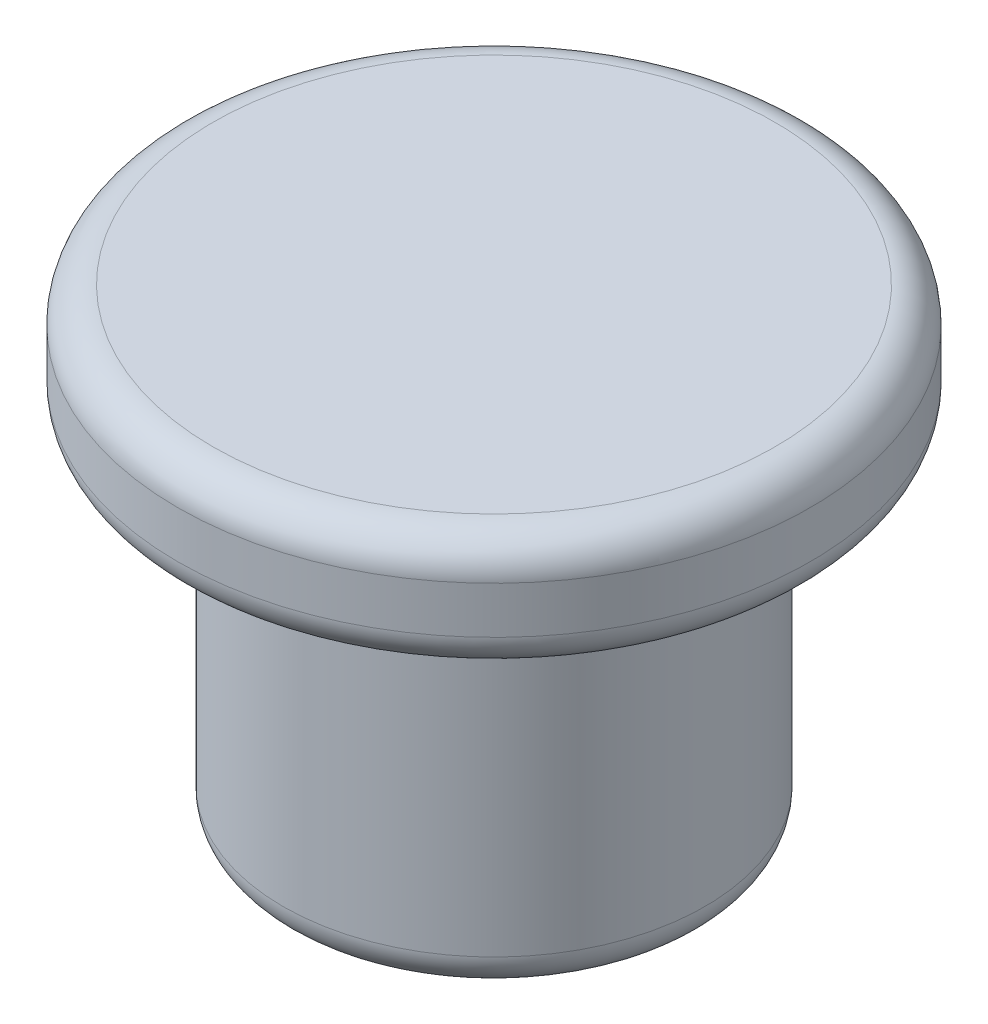
ISO-10303-21;
HEADER;
FILE_DESCRIPTION(('STEP AP214'),'2;1');
FILE_NAME('part.step','',(''),(''),'','','');
FILE_SCHEMA(('AUTOMOTIVE_DESIGN { 1 0 10303 214 1 1 1 1 }'));
ENDSEC;
DATA;
#1=APPLICATION_CONTEXT('core data for automotive mechanical design processes');
#2=APPLICATION_PROTOCOL_DEFINITION('international standard','automotive_design',2000,#1);
#3=PRODUCT_CONTEXT('',#1,'mechanical');
#4=PRODUCT('Part','Part','',(#3));
#5=PRODUCT_RELATED_PRODUCT_CATEGORY('part','',(#4));
#6=PRODUCT_DEFINITION_FORMATION('','',#4);
#7=PRODUCT_DEFINITION_CONTEXT('part definition',#1,'design');
#8=PRODUCT_DEFINITION('design','',#6,#7);
#9=PRODUCT_DEFINITION_SHAPE('','',#8);
#10=(LENGTH_UNIT() NAMED_UNIT(*) SI_UNIT(.MILLI.,.METRE.));
#11=(NAMED_UNIT(*) PLANE_ANGLE_UNIT() SI_UNIT($,.RADIAN.));
#12=(NAMED_UNIT(*) SI_UNIT($,.STERADIAN.) SOLID_ANGLE_UNIT());
#13=UNCERTAINTY_MEASURE_WITH_UNIT(LENGTH_MEASURE(1.E-05),#10,'distance_accuracy_value','');
#14=(GEOMETRIC_REPRESENTATION_CONTEXT(3) GLOBAL_UNCERTAINTY_ASSIGNED_CONTEXT((#13)) GLOBAL_UNIT_ASSIGNED_CONTEXT((#10,
#11,#12)) REPRESENTATION_CONTEXT('',''));
#15=CARTESIAN_POINT('',(0.,0.,0.));
#16=DIRECTION('',(0.,0.,1.));
#17=DIRECTION('',(1.,0.,0.));
#18=AXIS2_PLACEMENT_3D('',#15,#16,#17);
#19=CARTESIAN_POINT('',(-14.,0.,0.));
#20=DIRECTION('',(0.,-1.,0.));
#21=DIRECTION('',(0.,0.,-1.));
#22=AXIS2_PLACEMENT_3D('',#19,#20,#21);
#23=PLANE('',#22);
#24=CARTESIAN_POINT('',(0.,0.,0.));
#25=DIRECTION('',(0.,-1.,0.));
#26=DIRECTION('',(0.,0.,-1.));
#27=AXIS2_PLACEMENT_3D('',#24,#25,#26);
#28=CIRCLE('',#27,15.);
#29=CARTESIAN_POINT('',(0.,0.,-15.));
#30=VERTEX_POINT('',#29);
#31=EDGE_CURVE('E52',#30,#30,#28,.T.);
#32=ORIENTED_EDGE('',*,*,#31,.T.);
#33=EDGE_LOOP('',(#32));
#34=FACE_BOUND('',#33,.T.);
#35=CARTESIAN_POINT('',(0.,0.,0.));
#36=DIRECTION('',(0.,1.,0.));
#37=DIRECTION('',(0.,0.,1.));
#38=AXIS2_PLACEMENT_3D('',#35,#36,#37);
#39=CIRCLE('',#38,14.);
#40=CARTESIAN_POINT('',(0.,0.,14.));
#41=VERTEX_POINT('',#40);
#42=EDGE_CURVE('E79',#41,#41,#39,.T.);
#43=ORIENTED_EDGE('',*,*,#42,.T.);
#44=EDGE_LOOP('',(#43));
#45=FACE_BOUND('',#44,.T.);
#46=ADVANCED_FACE('F41',(#34,#45),#23,.T.);
#47=CARTESIAN_POINT('',(0.,0.,0.));
#48=DIRECTION('',(0.,1.,0.));
#49=DIRECTION('',(0.,0.,1.));
#50=AXIS2_PLACEMENT_3D('',#47,#48,#49);
#51=CYLINDRICAL_SURFACE('',#50,18.);
#52=CARTESIAN_POINT('',(0.,3.,0.));
#53=DIRECTION('',(0.,-1.,0.));
#54=DIRECTION('',(0.,0.,-1.));
#55=AXIS2_PLACEMENT_3D('',#52,#53,#54);
#56=CIRCLE('',#55,18.);
#57=CARTESIAN_POINT('',(0.,3.,-18.));
#58=VERTEX_POINT('',#57);
#59=EDGE_CURVE('E56',#58,#58,#56,.F.);
#60=ORIENTED_EDGE('',*,*,#59,.T.);
#61=EDGE_LOOP('',(#60));
#62=FACE_BOUND('',#61,.T.);
#63=CARTESIAN_POINT('',(0.,27.,0.));
#64=DIRECTION('',(0.,-1.,0.));
#65=DIRECTION('',(0.,0.,-1.));
#66=AXIS2_PLACEMENT_3D('',#63,#64,#65);
#67=CIRCLE('',#66,18.);
#68=CARTESIAN_POINT('',(0.,27.,-18.));
#69=VERTEX_POINT('',#68);
#70=EDGE_CURVE('E61',#69,#69,#67,.T.);
#71=ORIENTED_EDGE('',*,*,#70,.T.);
#72=EDGE_LOOP('',(#71));
#73=FACE_BOUND('',#72,.T.);
#74=ADVANCED_FACE('F101',(#62,#73),#51,.T.);
#75=CARTESIAN_POINT('',(-18.,30.,0.));
#76=DIRECTION('',(0.,-1.,0.));
#77=DIRECTION('',(0.,0.,-1.));
#78=AXIS2_PLACEMENT_3D('',#75,#76,#77);
#79=PLANE('',#78);
#80=CARTESIAN_POINT('',(0.,30.,0.));
#81=DIRECTION('',(0.,-1.,0.));
#82=DIRECTION('',(0.,0.,-1.));
#83=AXIS2_PLACEMENT_3D('',#80,#81,#82);
#84=CIRCLE('',#83,21.);
#85=CARTESIAN_POINT('',(0.,30.,-21.));
#86=VERTEX_POINT('',#85);
#87=EDGE_CURVE('E10',#86,#86,#84,.F.);
#88=ORIENTED_EDGE('',*,*,#87,.T.);
#89=EDGE_LOOP('',(#88));
#90=FACE_BOUND('',#89,.T.);
#91=CARTESIAN_POINT('',(0.,30.,0.));
#92=DIRECTION('',(0.,-1.,0.));
#93=DIRECTION('',(0.,0.,-1.));
#94=AXIS2_PLACEMENT_3D('',#91,#92,#93);
#95=CIRCLE('',#94,24.);
#96=CARTESIAN_POINT('',(0.,30.,-24.));
#97=VERTEX_POINT('',#96);
#98=EDGE_CURVE('E48',#97,#97,#95,.T.);
#99=ORIENTED_EDGE('',*,*,#98,.T.);
#100=EDGE_LOOP('',(#99));
#101=FACE_BOUND('',#100,.T.);
#102=ADVANCED_FACE('F107',(#90,#101),#79,.T.);
#103=CARTESIAN_POINT('',(0.,0.,0.));
#104=DIRECTION('',(0.,1.,0.));
#105=DIRECTION('',(0.,0.,1.));
#106=AXIS2_PLACEMENT_3D('',#103,#104,#105);
#107=CYLINDRICAL_SURFACE('',#106,27.);
#108=CARTESIAN_POINT('',(0.,37.0000000000122,0.));
#109=DIRECTION('',(0.,1.,0.));
#110=DIRECTION('',(0.,0.,1.));
#111=AXIS2_PLACEMENT_3D('',#108,#109,#110);
#112=CIRCLE('',#111,27.);
#113=CARTESIAN_POINT('',(0.,37.0000000000122,27.));
#114=VERTEX_POINT('',#113);
#115=EDGE_CURVE('E70',#114,#114,#112,.F.);
#116=ORIENTED_EDGE('',*,*,#115,.T.);
#117=EDGE_LOOP('',(#116));
#118=FACE_BOUND('',#117,.T.);
#119=CARTESIAN_POINT('',(0.,33.,0.));
#120=DIRECTION('',(0.,-1.,0.));
#121=DIRECTION('',(0.,0.,-1.));
#122=AXIS2_PLACEMENT_3D('',#119,#120,#121);
#123=CIRCLE('',#122,27.);
#124=CARTESIAN_POINT('',(0.,33.,-27.));
#125=VERTEX_POINT('',#124);
#126=EDGE_CURVE('E73',#125,#125,#123,.F.);
#127=ORIENTED_EDGE('',*,*,#126,.T.);
#128=EDGE_LOOP('',(#127));
#129=FACE_BOUND('',#128,.T.);
#130=ADVANCED_FACE('F133',(#118,#129),#107,.T.);
#131=CARTESIAN_POINT('',(-27.,40.0000000000122,0.));
#132=DIRECTION('',(0.,1.,0.));
#133=DIRECTION('',(0.,0.,1.));
#134=AXIS2_PLACEMENT_3D('',#131,#132,#133);
#135=PLANE('',#134);
#136=CARTESIAN_POINT('',(0.,40.0000000000122,0.));
#137=DIRECTION('',(0.,1.,0.));
#138=DIRECTION('',(0.,0.,1.));
#139=AXIS2_PLACEMENT_3D('',#136,#137,#138);
#140=CIRCLE('',#139,24.);
#141=CARTESIAN_POINT('',(0.,40.0000000000122,24.));
#142=VERTEX_POINT('',#141);
#143=EDGE_CURVE('E76',#142,#142,#140,.T.);
#144=ORIENTED_EDGE('',*,*,#143,.T.);
#145=EDGE_LOOP('',(#144));
#146=FACE_BOUND('',#145,.T.);
#147=ADVANCED_FACE('F97',(#146),#135,.T.);
#148=CARTESIAN_POINT('',(-14.,30.0000000000001,0.));
#149=DIRECTION('',(0.,-1.,0.));
#150=DIRECTION('',(0.,0.,-1.));
#151=AXIS2_PLACEMENT_3D('',#148,#149,#150);
#152=PLANE('',#151);
#153=CARTESIAN_POINT('',(0.,30.0000000000001,0.));
#154=DIRECTION('',(0.,-1.,0.));
#155=DIRECTION('',(0.,0.,-1.));
#156=AXIS2_PLACEMENT_3D('',#153,#154,#155);
#157=CIRCLE('',#156,11.);
#158=CARTESIAN_POINT('',(0.,30.0000000000001,-11.));
#159=VERTEX_POINT('',#158);
#160=EDGE_CURVE('E64',#159,#159,#157,.T.);
#161=ORIENTED_EDGE('',*,*,#160,.T.);
#162=EDGE_LOOP('',(#161));
#163=FACE_BOUND('',#162,.T.);
#164=ADVANCED_FACE('F87',(#163),#152,.T.);
#165=CARTESIAN_POINT('',(0.,0.,0.));
#166=DIRECTION('',(0.,1.,0.));
#167=DIRECTION('',(0.,0.,1.));
#168=AXIS2_PLACEMENT_3D('',#165,#166,#167);
#169=CYLINDRICAL_SURFACE('',#168,14.);
#170=CARTESIAN_POINT('',(0.,27.0000000000001,0.));
#171=DIRECTION('',(0.,-1.,0.));
#172=DIRECTION('',(0.,0.,-1.));
#173=AXIS2_PLACEMENT_3D('',#170,#171,#172);
#174=CIRCLE('',#173,14.);
#175=CARTESIAN_POINT('',(0.,27.0000000000001,-14.));
#176=VERTEX_POINT('',#175);
#177=EDGE_CURVE('E67',#176,#176,#174,.F.);
#178=ORIENTED_EDGE('',*,*,#177,.T.);
#179=EDGE_LOOP('',(#178));
#180=FACE_BOUND('',#179,.T.);
#181=ORIENTED_EDGE('',*,*,#42,.F.);
#182=EDGE_LOOP('',(#181));
#183=FACE_BOUND('',#182,.T.);
#184=ADVANCED_FACE('F84',(#180,#183),#169,.F.);
#185=CARTESIAN_POINT('',(0.,37.0000000000122,0.));
#186=DIRECTION('',(0.,1.,0.));
#187=DIRECTION('',(0.,0.,1.));
#188=AXIS2_PLACEMENT_3D('',#185,#186,#187);
#189=TOROIDAL_SURFACE('',#188,24.,3.);
#190=ORIENTED_EDGE('',*,*,#115,.F.);
#191=EDGE_LOOP('',(#190));
#192=FACE_BOUND('',#191,.T.);
#193=ORIENTED_EDGE('',*,*,#143,.F.);
#194=EDGE_LOOP('',(#193));
#195=FACE_BOUND('',#194,.T.);
#196=ADVANCED_FACE('F86',(#192,#195),#189,.T.);
#197=CARTESIAN_POINT('',(0.,27.0000000000001,0.));
#198=DIRECTION('',(0.,-1.,0.));
#199=DIRECTION('',(0.,0.,-1.));
#200=AXIS2_PLACEMENT_3D('',#197,#198,#199);
#201=TOROIDAL_SURFACE('',#200,11.,3.);
#202=ORIENTED_EDGE('',*,*,#160,.F.);
#203=EDGE_LOOP('',(#202));
#204=FACE_BOUND('',#203,.T.);
#205=ORIENTED_EDGE('',*,*,#177,.F.);
#206=EDGE_LOOP('',(#205));
#207=FACE_BOUND('',#206,.T.);
#208=ADVANCED_FACE('F94',(#204,#207),#201,.F.);
#209=CARTESIAN_POINT('',(0.,3.,0.));
#210=DIRECTION('',(0.,-1.,0.));
#211=DIRECTION('',(0.,0.,-1.));
#212=AXIS2_PLACEMENT_3D('',#209,#210,#211);
#213=TOROIDAL_SURFACE('',#212,15.,3.);
#214=ORIENTED_EDGE('',*,*,#31,.F.);
#215=EDGE_LOOP('',(#214));
#216=FACE_BOUND('',#215,.T.);
#217=ORIENTED_EDGE('',*,*,#59,.F.);
#218=EDGE_LOOP('',(#217));
#219=FACE_BOUND('',#218,.T.);
#220=ADVANCED_FACE('F114',(#216,#219),#213,.T.);
#221=CARTESIAN_POINT('',(0.,27.,0.));
#222=DIRECTION('',(0.,-1.,0.));
#223=DIRECTION('',(0.,0.,-1.));
#224=AXIS2_PLACEMENT_3D('',#221,#222,#223);
#225=TOROIDAL_SURFACE('',#224,21.,3.);
#226=ORIENTED_EDGE('',*,*,#70,.F.);
#227=EDGE_LOOP('',(#226));
#228=FACE_BOUND('',#227,.T.);
#229=ORIENTED_EDGE('',*,*,#87,.F.);
#230=EDGE_LOOP('',(#229));
#231=FACE_BOUND('',#230,.T.);
#232=ADVANCED_FACE('F117',(#228,#231),#225,.F.);
#233=CARTESIAN_POINT('',(0.,33.,0.));
#234=DIRECTION('',(0.,-1.,0.));
#235=DIRECTION('',(0.,0.,-1.));
#236=AXIS2_PLACEMENT_3D('',#233,#234,#235);
#237=TOROIDAL_SURFACE('',#236,24.,3.);
#238=ORIENTED_EDGE('',*,*,#98,.F.);
#239=EDGE_LOOP('',(#238));
#240=FACE_BOUND('',#239,.T.);
#241=ORIENTED_EDGE('',*,*,#126,.F.);
#242=EDGE_LOOP('',(#241));
#243=FACE_BOUND('',#242,.T.);
#244=ADVANCED_FACE('F43',(#240,#243),#237,.T.);
#245=CLOSED_SHELL('',(#46,#74,#102,#130,#147,#164,#184,#196,#208,#220,#232,#244));
#246=MANIFOLD_SOLID_BREP('B2',#245);
#247=ADVANCED_BREP_SHAPE_REPRESENTATION('',(#18,#246),#14);
#248=SHAPE_DEFINITION_REPRESENTATION(#9,#247);
ENDSEC;
END-ISO-10303-21;
